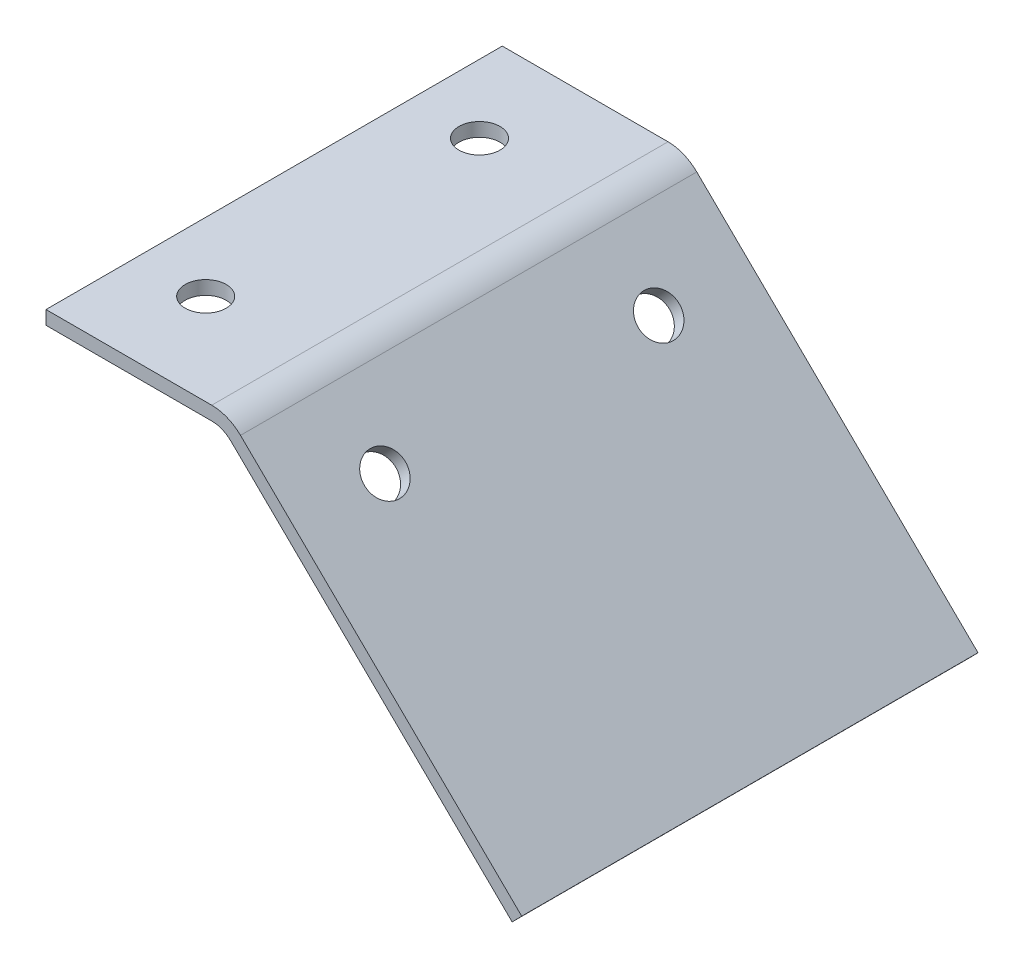
ISO-10303-21;
HEADER;
FILE_DESCRIPTION(('STEP AP214'),'2;1');
FILE_NAME('part.step','',(''),(''),'','','');
FILE_SCHEMA(('AUTOMOTIVE_DESIGN { 1 0 10303 214 1 1 1 1 }'));
ENDSEC;
DATA;
#1=APPLICATION_CONTEXT('core data for automotive mechanical design processes');
#2=APPLICATION_PROTOCOL_DEFINITION('international standard','automotive_design',2000,#1);
#3=PRODUCT_CONTEXT('',#1,'mechanical');
#4=PRODUCT('Part','Part','',(#3));
#5=PRODUCT_RELATED_PRODUCT_CATEGORY('part','',(#4));
#6=PRODUCT_DEFINITION_FORMATION('','',#4);
#7=PRODUCT_DEFINITION_CONTEXT('part definition',#1,'design');
#8=PRODUCT_DEFINITION('design','',#6,#7);
#9=PRODUCT_DEFINITION_SHAPE('','',#8);
#10=(LENGTH_UNIT() NAMED_UNIT(*) SI_UNIT(.MILLI.,.METRE.));
#11=(NAMED_UNIT(*) PLANE_ANGLE_UNIT() SI_UNIT($,.RADIAN.));
#12=(NAMED_UNIT(*) SI_UNIT($,.STERADIAN.) SOLID_ANGLE_UNIT());
#13=UNCERTAINTY_MEASURE_WITH_UNIT(LENGTH_MEASURE(1.E-05),#10,'distance_accuracy_value','');
#14=(GEOMETRIC_REPRESENTATION_CONTEXT(3) GLOBAL_UNCERTAINTY_ASSIGNED_CONTEXT((#13)) GLOBAL_UNIT_ASSIGNED_CONTEXT((#10,
#11,#12)) REPRESENTATION_CONTEXT('',''));
#15=CARTESIAN_POINT('',(0.,0.,0.));
#16=DIRECTION('',(0.,0.,1.));
#17=DIRECTION('',(1.,0.,0.));
#18=AXIS2_PLACEMENT_3D('',#15,#16,#17);
#19=CARTESIAN_POINT('',(-10.,1.5,25.));
#20=DIRECTION('',(1.,0.,0.));
#21=DIRECTION('',(0.,0.,1.));
#22=AXIS2_PLACEMENT_3D('',#19,#20,#21);
#23=PLANE('',#22);
#24=DIRECTION('',(0.,1.,0.));
#25=VECTOR('',#24,1.);
#26=CARTESIAN_POINT('',(-10.,1.5,-25.));
#27=LINE('',#26,#25);
#28=CARTESIAN_POINT('',(-10.,0.,-25.));
#29=VERTEX_POINT('',#28);
#30=CARTESIAN_POINT('',(-10.,1.5,-25.));
#31=VERTEX_POINT('',#30);
#32=EDGE_CURVE('E11',#29,#31,#27,.T.);
#33=ORIENTED_EDGE('',*,*,#32,.F.);
#34=DIRECTION('',(0.,0.,-1.));
#35=VECTOR('',#34,1.);
#36=CARTESIAN_POINT('',(-10.,0.,0.));
#37=LINE('',#36,#35);
#38=CARTESIAN_POINT('',(-10.,0.,25.));
#39=VERTEX_POINT('',#38);
#40=EDGE_CURVE('E104',#29,#39,#37,.F.);
#41=ORIENTED_EDGE('',*,*,#40,.T.);
#42=DIRECTION('',(0.,1.,0.));
#43=VECTOR('',#42,1.);
#44=CARTESIAN_POINT('',(-10.,1.5,25.));
#45=LINE('',#44,#43);
#46=CARTESIAN_POINT('',(-10.,1.5,25.));
#47=VERTEX_POINT('',#46);
#48=EDGE_CURVE('E48',#39,#47,#45,.T.);
#49=ORIENTED_EDGE('',*,*,#48,.T.);
#50=DIRECTION('',(0.,0.,1.));
#51=VECTOR('',#50,1.);
#52=CARTESIAN_POINT('',(-10.,1.5,25.));
#53=LINE('',#52,#51);
#54=EDGE_CURVE('E130',#31,#47,#53,.T.);
#55=ORIENTED_EDGE('',*,*,#54,.F.);
#56=EDGE_LOOP('',(#33,#41,#49,#55));
#57=FACE_BOUND('',#56,.T.);
#58=ADVANCED_FACE('F39',(#57),#23,.F.);
#59=CARTESIAN_POINT('',(10.,1.5,25.));
#60=DIRECTION('',(0.,0.,-1.));
#61=DIRECTION('',(0.713975527626653,-0.700170654876539,0.));
#62=AXIS2_PLACEMENT_3D('',#59,#60,#61);
#63=PLANE('',#62);
#64=DIRECTION('',(0.713975527626653,-0.700170654876539,0.));
#65=VECTOR('',#64,1.);
#66=CARTESIAN_POINT('',(10.,1.5,25.));
#67=LINE('',#66,#65);
#68=CARTESIAN_POINT('',(11.3124873553264,0.21288987431994,25.));
#69=VERTEX_POINT('',#68);
#70=CARTESIAN_POINT('',(42.1288987431994,-30.0076794694443,25.));
#71=VERTEX_POINT('',#70);
#72=EDGE_CURVE('E255',#69,#71,#67,.T.);
#73=ORIENTED_EDGE('',*,*,#72,.F.);
#74=CARTESIAN_POINT('',(8.16171940838193,-3.,25.));
#75=DIRECTION('',(0.,0.,1.));
#76=DIRECTION('',(1.,0.,0.));
#77=AXIS2_PLACEMENT_3D('',#74,#75,#76);
#78=CIRCLE('',#77,4.5);
#79=CARTESIAN_POINT('',(8.16171940838193,1.5,25.));
#80=VERTEX_POINT('',#79);
#81=EDGE_CURVE('E145',#80,#69,#78,.F.);
#82=ORIENTED_EDGE('',*,*,#81,.F.);
#83=DIRECTION('',(1.,0.,0.));
#84=VECTOR('',#83,1.);
#85=CARTESIAN_POINT('',(-10.,1.5,25.));
#86=LINE('',#85,#84);
#87=EDGE_CURVE('E139',#47,#80,#86,.T.);
#88=ORIENTED_EDGE('',*,*,#87,.F.);
#89=ORIENTED_EDGE('',*,*,#48,.F.);
#90=DIRECTION('',(1.,0.,0.));
#91=VECTOR('',#90,1.);
#92=CARTESIAN_POINT('',(0.,0.,25.));
#93=LINE('',#92,#91);
#94=CARTESIAN_POINT('',(8.16171940838193,0.,25.));
#95=VERTEX_POINT('',#94);
#96=EDGE_CURVE('E240',#39,#95,#93,.T.);
#97=ORIENTED_EDGE('',*,*,#96,.T.);
#98=CARTESIAN_POINT('',(8.16171940838193,-3.,25.));
#99=DIRECTION('',(0.,0.,-1.));
#100=DIRECTION('',(-1.,0.,0.));
#101=AXIS2_PLACEMENT_3D('',#98,#99,#100);
#102=CIRCLE('',#101,3.);
#103=CARTESIAN_POINT('',(10.2622313730115,-0.85807341712004,25.));
#104=VERTEX_POINT('',#103);
#105=EDGE_CURVE('E92',#95,#104,#102,.T.);
#106=ORIENTED_EDGE('',*,*,#105,.T.);
#107=DIRECTION('',(0.713975527626653,-0.700170654876539,0.));
#108=VECTOR('',#107,1.);
#109=CARTESIAN_POINT('',(8.94974401768519,0.42903670856002,25.));
#110=LINE('',#109,#108);
#111=CARTESIAN_POINT('',(41.0786427608846,-31.0786427608843,25.));
#112=VERTEX_POINT('',#111);
#113=EDGE_CURVE('E243',#104,#112,#110,.T.);
#114=ORIENTED_EDGE('',*,*,#113,.T.);
#115=DIRECTION('',(0.700170654876539,0.713975527626653,0.));
#116=VECTOR('',#115,1.);
#117=CARTESIAN_POINT('',(42.1288987431994,-30.0076794694443,25.));
#118=LINE('',#117,#116);
#119=EDGE_CURVE('E121',#112,#71,#118,.T.);
#120=ORIENTED_EDGE('',*,*,#119,.T.);
#121=EDGE_LOOP('',(#73,#82,#88,#89,#97,#106,#114,#120));
#122=FACE_BOUND('',#121,.T.);
#123=ADVANCED_FACE('F144',(#122),#63,.F.);
#124=CARTESIAN_POINT('',(42.1288987431994,-30.0076794694443,70.7562465527066));
#125=DIRECTION('',(-0.713975527626653,0.700170654876539,0.));
#126=DIRECTION('',(0.,0.,-1.));
#127=AXIS2_PLACEMENT_3D('',#124,#125,#126);
#128=PLANE('',#127);
#129=ORIENTED_EDGE('',*,*,#119,.F.);
#130=DIRECTION('',(0.,0.,1.));
#131=VECTOR('',#130,1.);
#132=CARTESIAN_POINT('',(41.0786427608846,-31.0786427608843,70.7562465527066));
#133=LINE('',#132,#131);
#134=CARTESIAN_POINT('',(41.0786427608846,-31.0786427608843,-25.));
#135=VERTEX_POINT('',#134);
#136=EDGE_CURVE('E245',#112,#135,#133,.F.);
#137=ORIENTED_EDGE('',*,*,#136,.T.);
#138=DIRECTION('',(0.700170654876539,0.713975527626653,0.));
#139=VECTOR('',#138,1.);
#140=CARTESIAN_POINT('',(42.1288987431994,-30.0076794694443,-25.));
#141=LINE('',#140,#139);
#142=CARTESIAN_POINT('',(42.1288987431994,-30.0076794694443,-25.));
#143=VERTEX_POINT('',#142);
#144=EDGE_CURVE('E118',#135,#143,#141,.T.);
#145=ORIENTED_EDGE('',*,*,#144,.T.);
#146=DIRECTION('',(0.,0.,-1.));
#147=VECTOR('',#146,1.);
#148=CARTESIAN_POINT('',(42.1288987431994,-30.0076794694443,70.7562465527066));
#149=LINE('',#148,#147);
#150=EDGE_CURVE('E225',#71,#143,#149,.T.);
#151=ORIENTED_EDGE('',*,*,#150,.F.);
#152=EDGE_LOOP('',(#129,#137,#145,#151));
#153=FACE_BOUND('',#152,.T.);
#154=ADVANCED_FACE('F169',(#153),#128,.F.);
#155=CARTESIAN_POINT('',(-2.49999999999999,1.5,-15.));
#156=DIRECTION('',(0.,-1.,0.));
#157=DIRECTION('',(0.,0.,-1.));
#158=AXIS2_PLACEMENT_3D('',#155,#156,#157);
#159=CYLINDRICAL_SURFACE('',#158,2.25);
#160=CARTESIAN_POINT('',(-2.49999999999999,1.5,-15.));
#161=DIRECTION('',(0.,1.,0.));
#162=DIRECTION('',(0.,0.,1.));
#163=AXIS2_PLACEMENT_3D('',#160,#161,#162);
#164=CIRCLE('',#163,2.25);
#165=CARTESIAN_POINT('',(-2.49999999999999,1.5,-12.75));
#166=VERTEX_POINT('',#165);
#167=EDGE_CURVE('E234',#166,#166,#164,.T.);
#168=ORIENTED_EDGE('',*,*,#167,.T.);
#169=EDGE_LOOP('',(#168));
#170=FACE_BOUND('',#169,.T.);
#171=CARTESIAN_POINT('',(-2.49999999999999,0.,-15.));
#172=DIRECTION('',(0.,1.,0.));
#173=DIRECTION('',(0.,0.,1.));
#174=AXIS2_PLACEMENT_3D('',#171,#172,#173);
#175=CIRCLE('',#174,2.25);
#176=CARTESIAN_POINT('',(-2.49999999999999,0.,-12.75));
#177=VERTEX_POINT('',#176);
#178=EDGE_CURVE('E110',#177,#177,#175,.T.);
#179=ORIENTED_EDGE('',*,*,#178,.F.);
#180=EDGE_LOOP('',(#179));
#181=FACE_BOUND('',#180,.T.);
#182=ADVANCED_FACE('F172',(#170,#181),#159,.F.);
#183=CARTESIAN_POINT('',(-2.49999999999999,1.5,15.));
#184=DIRECTION('',(0.,-1.,0.));
#185=DIRECTION('',(0.,0.,-1.));
#186=AXIS2_PLACEMENT_3D('',#183,#184,#185);
#187=CYLINDRICAL_SURFACE('',#186,2.25);
#188=CARTESIAN_POINT('',(-2.49999999999999,1.5,15.));
#189=DIRECTION('',(0.,1.,0.));
#190=DIRECTION('',(0.,0.,1.));
#191=AXIS2_PLACEMENT_3D('',#188,#189,#190);
#192=CIRCLE('',#191,2.25);
#193=CARTESIAN_POINT('',(-2.49999999999999,1.5,17.25));
#194=VERTEX_POINT('',#193);
#195=EDGE_CURVE('E190',#194,#194,#192,.T.);
#196=ORIENTED_EDGE('',*,*,#195,.T.);
#197=EDGE_LOOP('',(#196));
#198=FACE_BOUND('',#197,.T.);
#199=CARTESIAN_POINT('',(-2.49999999999999,0.,15.));
#200=DIRECTION('',(0.,1.,0.));
#201=DIRECTION('',(0.,0.,1.));
#202=AXIS2_PLACEMENT_3D('',#199,#200,#201);
#203=CIRCLE('',#202,2.25);
#204=CARTESIAN_POINT('',(-2.49999999999999,0.,17.25));
#205=VERTEX_POINT('',#204);
#206=EDGE_CURVE('E105',#205,#205,#203,.T.);
#207=ORIENTED_EDGE('',*,*,#206,.F.);
#208=EDGE_LOOP('',(#207));
#209=FACE_BOUND('',#208,.T.);
#210=ADVANCED_FACE('F163',(#198,#209),#187,.F.);
#211=CARTESIAN_POINT('',(17.1400954644222,-5.50204015930876,-15.));
#212=DIRECTION('',(-0.700170654876539,-0.713975527626653,0.));
#213=DIRECTION('',(0.713975527626653,-0.700170654876539,0.));
#214=AXIS2_PLACEMENT_3D('',#211,#212,#213);
#215=ELLIPSE('',#214,2.25010720582438,2.25);
#216=DIRECTION('',(-0.700170654876539,-0.713975527626653,0.));
#217=VECTOR('',#216,1.);
#218=SURFACE_OF_LINEAR_EXTRUSION('',#215,#217);
#219=CARTESIAN_POINT('',(18.7466169439172,-7.07749919515323,-15.));
#220=VERTEX_POINT('',#219);
#221=EDGE_CURVE('E147',#220,#220,#215,.T.);
#222=ORIENTED_EDGE('',*,*,#221,.F.);
#223=EDGE_LOOP('',(#222));
#224=FACE_BOUND('',#223,.T.);
#225=CARTESIAN_POINT('',(16.0898394821074,-6.57300345074874,-15.));
#226=DIRECTION('',(-0.700170654876539,-0.713975527626653,0.));
#227=DIRECTION('',(0.713975527626653,-0.700170654876539,0.));
#228=AXIS2_PLACEMENT_3D('',#225,#226,#227);
#229=ELLIPSE('',#228,2.25010720582438,2.25);
#230=CARTESIAN_POINT('',(17.6963609616024,-8.14846248659321,-15.));
#231=VERTEX_POINT('',#230);
#232=EDGE_CURVE('E236',#231,#231,#229,.T.);
#233=ORIENTED_EDGE('',*,*,#232,.T.);
#234=EDGE_LOOP('',(#233));
#235=FACE_BOUND('',#234,.T.);
#236=ADVANCED_FACE('F158',(#224,#235),#218,.F.);
#237=CARTESIAN_POINT('',(17.1400954644222,-5.50204015930876,15.));
#238=DIRECTION('',(-0.700170654876539,-0.713975527626653,0.));
#239=DIRECTION('',(0.713975527626653,-0.700170654876539,0.));
#240=AXIS2_PLACEMENT_3D('',#237,#238,#239);
#241=ELLIPSE('',#240,2.25010720582437,2.25);
#242=DIRECTION('',(-0.700170654876539,-0.713975527626653,0.));
#243=VECTOR('',#242,1.);
#244=SURFACE_OF_LINEAR_EXTRUSION('',#241,#243);
#245=CARTESIAN_POINT('',(18.7466169439172,-7.07749919515323,15.));
#246=VERTEX_POINT('',#245);
#247=EDGE_CURVE('E150',#246,#246,#241,.T.);
#248=ORIENTED_EDGE('',*,*,#247,.F.);
#249=EDGE_LOOP('',(#248));
#250=FACE_BOUND('',#249,.T.);
#251=CARTESIAN_POINT('',(16.0898394821074,-6.57300345074874,15.));
#252=DIRECTION('',(-0.700170654876539,-0.713975527626653,0.));
#253=DIRECTION('',(0.713975527626653,-0.700170654876539,0.));
#254=AXIS2_PLACEMENT_3D('',#251,#252,#253);
#255=ELLIPSE('',#254,2.25010720582437,2.25);
#256=CARTESIAN_POINT('',(17.6963609616024,-8.14846248659321,15.));
#257=VERTEX_POINT('',#256);
#258=EDGE_CURVE('E239',#257,#257,#255,.T.);
#259=ORIENTED_EDGE('',*,*,#258,.T.);
#260=EDGE_LOOP('',(#259));
#261=FACE_BOUND('',#260,.T.);
#262=ADVANCED_FACE('F162',(#250,#261),#244,.F.);
#263=CARTESIAN_POINT('',(8.16171940838193,-3.,-25.));
#264=DIRECTION('',(0.,0.,-1.));
#265=DIRECTION('',(-1.,0.,0.));
#266=AXIS2_PLACEMENT_3D('',#263,#264,#265);
#267=PLANE('',#266);
#268=CARTESIAN_POINT('',(8.16171940838193,-3.,-25.));
#269=DIRECTION('',(0.,0.,-1.));
#270=DIRECTION('',(-1.,0.,0.));
#271=AXIS2_PLACEMENT_3D('',#268,#269,#270);
#272=CIRCLE('',#271,3.);
#273=CARTESIAN_POINT('',(10.2622313730115,-0.858073417120039,-25.));
#274=VERTEX_POINT('',#273);
#275=CARTESIAN_POINT('',(8.16171940838193,0.,-25.));
#276=VERTEX_POINT('',#275);
#277=EDGE_CURVE('E89',#274,#276,#272,.F.);
#278=ORIENTED_EDGE('',*,*,#277,.T.);
#279=DIRECTION('',(1.,0.,0.));
#280=VECTOR('',#279,1.);
#281=CARTESIAN_POINT('',(0.,0.,-25.));
#282=LINE('',#281,#280);
#283=EDGE_CURVE('E101',#276,#29,#282,.F.);
#284=ORIENTED_EDGE('',*,*,#283,.T.);
#285=ORIENTED_EDGE('',*,*,#32,.T.);
#286=DIRECTION('',(-1.,0.,0.));
#287=VECTOR('',#286,1.);
#288=CARTESIAN_POINT('',(-10.,1.5,-25.));
#289=LINE('',#288,#287);
#290=CARTESIAN_POINT('',(8.16171940838193,1.5,-25.));
#291=VERTEX_POINT('',#290);
#292=EDGE_CURVE('E141',#291,#31,#289,.T.);
#293=ORIENTED_EDGE('',*,*,#292,.F.);
#294=CARTESIAN_POINT('',(8.16171940838193,-3.,-25.));
#295=DIRECTION('',(0.,0.,1.));
#296=DIRECTION('',(1.,0.,0.));
#297=AXIS2_PLACEMENT_3D('',#294,#295,#296);
#298=CIRCLE('',#297,4.5);
#299=CARTESIAN_POINT('',(11.3124873553264,0.212889874319941,-25.));
#300=VERTEX_POINT('',#299);
#301=EDGE_CURVE('E56',#300,#291,#298,.T.);
#302=ORIENTED_EDGE('',*,*,#301,.F.);
#303=DIRECTION('',(0.713975527626653,-0.700170654876539,0.));
#304=VECTOR('',#303,1.);
#305=CARTESIAN_POINT('',(10.,1.5,-25.));
#306=LINE('',#305,#304);
#307=EDGE_CURVE('E220',#300,#143,#306,.T.);
#308=ORIENTED_EDGE('',*,*,#307,.T.);
#309=ORIENTED_EDGE('',*,*,#144,.F.);
#310=DIRECTION('',(0.713975527626653,-0.700170654876539,0.));
#311=VECTOR('',#310,1.);
#312=CARTESIAN_POINT('',(8.94974401768519,0.42903670856002,-25.));
#313=LINE('',#312,#311);
#314=EDGE_CURVE('E97',#274,#135,#313,.T.);
#315=ORIENTED_EDGE('',*,*,#314,.F.);
#316=EDGE_LOOP('',(#278,#284,#285,#293,#302,#308,#309,#315));
#317=FACE_BOUND('',#316,.T.);
#318=ADVANCED_FACE('F107',(#317),#267,.T.);
#319=CARTESIAN_POINT('',(10.,1.5,70.7562465527066));
#320=DIRECTION('',(-0.700170654876539,-0.713975527626653,0.));
#321=DIRECTION('',(0.713975527626653,-0.700170654876539,0.));
#322=AXIS2_PLACEMENT_3D('',#319,#320,#321);
#323=PLANE('',#322);
#324=ORIENTED_EDGE('',*,*,#221,.T.);
#325=EDGE_LOOP('',(#324));
#326=FACE_BOUND('',#325,.T.);
#327=ORIENTED_EDGE('',*,*,#247,.T.);
#328=EDGE_LOOP('',(#327));
#329=FACE_BOUND('',#328,.T.);
#330=ORIENTED_EDGE('',*,*,#307,.F.);
#331=DIRECTION('',(0.,0.,-1.));
#332=VECTOR('',#331,1.);
#333=CARTESIAN_POINT('',(11.3124873553264,0.21288987431994,70.7562465527066));
#334=LINE('',#333,#332);
#335=EDGE_CURVE('E122',#300,#69,#334,.F.);
#336=ORIENTED_EDGE('',*,*,#335,.T.);
#337=ORIENTED_EDGE('',*,*,#72,.T.);
#338=ORIENTED_EDGE('',*,*,#150,.T.);
#339=EDGE_LOOP('',(#330,#336,#337,#338));
#340=FACE_BOUND('',#339,.T.);
#341=ADVANCED_FACE('F180',(#326,#329,#340),#323,.F.);
#342=CARTESIAN_POINT('',(0.,1.5,0.));
#343=DIRECTION('',(0.,-1.,0.));
#344=DIRECTION('',(0.,0.,-1.));
#345=AXIS2_PLACEMENT_3D('',#342,#343,#344);
#346=PLANE('',#345);
#347=ORIENTED_EDGE('',*,*,#167,.F.);
#348=EDGE_LOOP('',(#347));
#349=FACE_BOUND('',#348,.T.);
#350=ORIENTED_EDGE('',*,*,#195,.F.);
#351=EDGE_LOOP('',(#350));
#352=FACE_BOUND('',#351,.T.);
#353=ORIENTED_EDGE('',*,*,#87,.T.);
#354=DIRECTION('',(0.,0.,-1.));
#355=VECTOR('',#354,1.);
#356=CARTESIAN_POINT('',(8.16171940838193,1.5,0.));
#357=LINE('',#356,#355);
#358=EDGE_CURVE('E226',#80,#291,#357,.T.);
#359=ORIENTED_EDGE('',*,*,#358,.T.);
#360=ORIENTED_EDGE('',*,*,#292,.T.);
#361=ORIENTED_EDGE('',*,*,#54,.T.);
#362=EDGE_LOOP('',(#353,#359,#360,#361));
#363=FACE_BOUND('',#362,.T.);
#364=ADVANCED_FACE('F41',(#349,#352,#363),#346,.F.);
#365=CARTESIAN_POINT('',(8.16171940838193,-3.,0.));
#366=DIRECTION('',(0.,0.,-1.));
#367=DIRECTION('',(-1.,0.,0.));
#368=AXIS2_PLACEMENT_3D('',#365,#366,#367);
#369=CYLINDRICAL_SURFACE('',#368,4.5);
#370=ORIENTED_EDGE('',*,*,#81,.T.);
#371=ORIENTED_EDGE('',*,*,#335,.F.);
#372=ORIENTED_EDGE('',*,*,#301,.T.);
#373=ORIENTED_EDGE('',*,*,#358,.F.);
#374=EDGE_LOOP('',(#370,#371,#372,#373));
#375=FACE_BOUND('',#374,.T.);
#376=ADVANCED_FACE('F200',(#375),#369,.T.);
#377=CARTESIAN_POINT('',(8.94974401768519,0.42903670856002,70.7562465527066));
#378=DIRECTION('',(-0.700170654876539,-0.713975527626653,0.));
#379=DIRECTION('',(0.713975527626653,-0.700170654876539,0.));
#380=AXIS2_PLACEMENT_3D('',#377,#378,#379);
#381=PLANE('',#380);
#382=ORIENTED_EDGE('',*,*,#232,.F.);
#383=EDGE_LOOP('',(#382));
#384=FACE_BOUND('',#383,.T.);
#385=ORIENTED_EDGE('',*,*,#258,.F.);
#386=EDGE_LOOP('',(#385));
#387=FACE_BOUND('',#386,.T.);
#388=ORIENTED_EDGE('',*,*,#314,.T.);
#389=ORIENTED_EDGE('',*,*,#136,.F.);
#390=ORIENTED_EDGE('',*,*,#113,.F.);
#391=DIRECTION('',(0.,0.,1.));
#392=VECTOR('',#391,1.);
#393=CARTESIAN_POINT('',(10.2622313730115,-0.858073417120039,70.7562465527066));
#394=LINE('',#393,#392);
#395=EDGE_CURVE('E96',#274,#104,#394,.T.);
#396=ORIENTED_EDGE('',*,*,#395,.F.);
#397=EDGE_LOOP('',(#388,#389,#390,#396));
#398=FACE_BOUND('',#397,.T.);
#399=ADVANCED_FACE('F194',(#384,#387,#398),#381,.T.);
#400=CARTESIAN_POINT('',(0.,0.,0.));
#401=DIRECTION('',(0.,-1.,0.));
#402=DIRECTION('',(0.,0.,-1.));
#403=AXIS2_PLACEMENT_3D('',#400,#401,#402);
#404=PLANE('',#403);
#405=ORIENTED_EDGE('',*,*,#178,.T.);
#406=EDGE_LOOP('',(#405));
#407=FACE_BOUND('',#406,.T.);
#408=ORIENTED_EDGE('',*,*,#206,.T.);
#409=EDGE_LOOP('',(#408));
#410=FACE_BOUND('',#409,.T.);
#411=ORIENTED_EDGE('',*,*,#96,.F.);
#412=ORIENTED_EDGE('',*,*,#40,.F.);
#413=ORIENTED_EDGE('',*,*,#283,.F.);
#414=DIRECTION('',(0.,0.,-1.));
#415=VECTOR('',#414,1.);
#416=CARTESIAN_POINT('',(8.16171940838193,0.,0.));
#417=LINE('',#416,#415);
#418=EDGE_CURVE('E85',#95,#276,#417,.T.);
#419=ORIENTED_EDGE('',*,*,#418,.F.);
#420=EDGE_LOOP('',(#411,#412,#413,#419));
#421=FACE_BOUND('',#420,.T.);
#422=ADVANCED_FACE('F102',(#407,#410,#421),#404,.T.);
#423=CARTESIAN_POINT('',(8.16171940838193,-3.,0.));
#424=DIRECTION('',(0.,0.,-1.));
#425=DIRECTION('',(-1.,0.,0.));
#426=AXIS2_PLACEMENT_3D('',#423,#424,#425);
#427=CYLINDRICAL_SURFACE('',#426,3.);
#428=ORIENTED_EDGE('',*,*,#105,.F.);
#429=ORIENTED_EDGE('',*,*,#418,.T.);
#430=ORIENTED_EDGE('',*,*,#277,.F.);
#431=ORIENTED_EDGE('',*,*,#395,.T.);
#432=EDGE_LOOP('',(#428,#429,#430,#431));
#433=FACE_BOUND('',#432,.T.);
#434=ADVANCED_FACE('F87',(#433),#427,.F.);
#435=CLOSED_SHELL('',(#58,#123,#154,#182,#210,#236,#262,#318,#341,#364,#376,#399,#422,#434));
#436=MANIFOLD_SOLID_BREP('B2',#435);
#437=ADVANCED_BREP_SHAPE_REPRESENTATION('',(#18,#436),#14);
#438=SHAPE_DEFINITION_REPRESENTATION(#9,#437);
ENDSEC;
END-ISO-10303-21;
